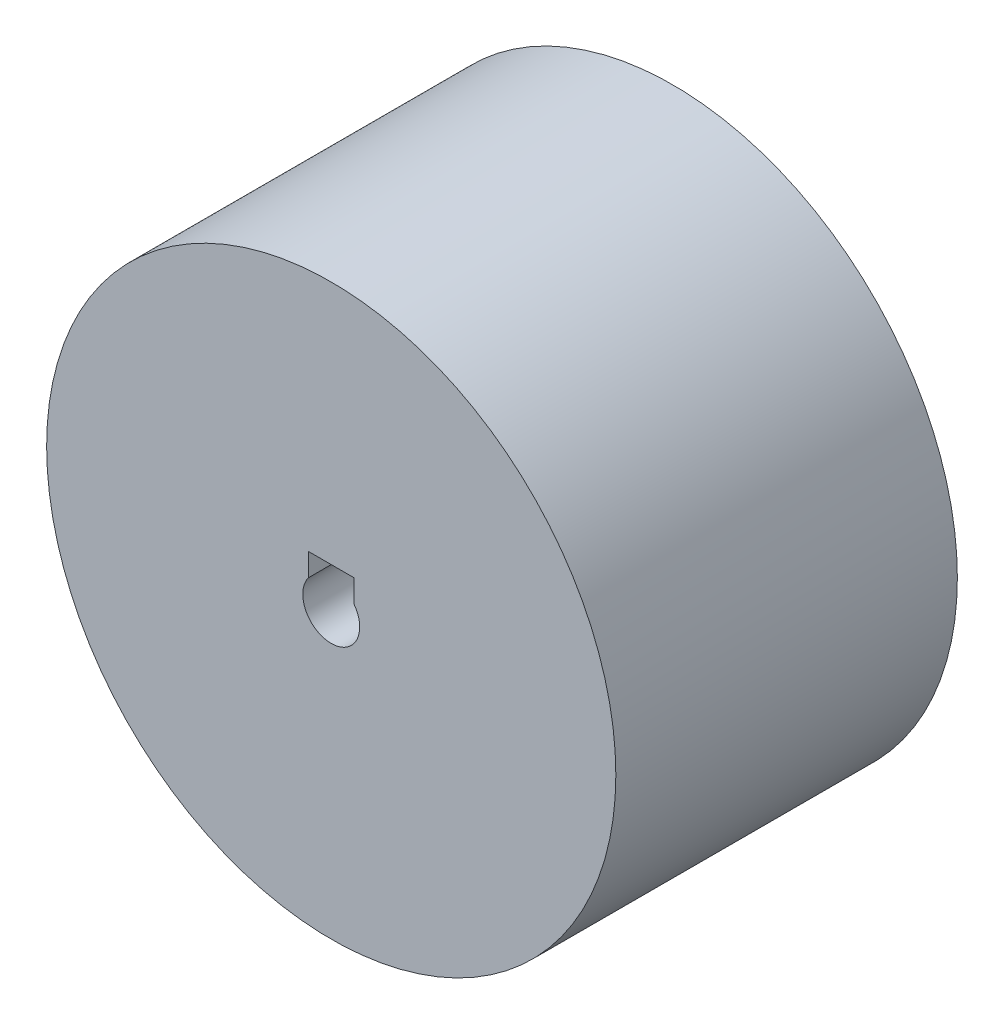
ISO-10303-21;
HEADER;
FILE_DESCRIPTION(('STEP AP214'),'2;1');
FILE_NAME('part.step','',(''),(''),'','','');
FILE_SCHEMA(('AUTOMOTIVE_DESIGN { 1 0 10303 214 1 1 1 1 }'));
ENDSEC;
DATA;
#1=APPLICATION_CONTEXT('core data for automotive mechanical design processes');
#2=APPLICATION_PROTOCOL_DEFINITION('international standard','automotive_design',2000,#1);
#3=PRODUCT_CONTEXT('',#1,'mechanical');
#4=PRODUCT('Part','Part','',(#3));
#5=PRODUCT_RELATED_PRODUCT_CATEGORY('part','',(#4));
#6=PRODUCT_DEFINITION_FORMATION('','',#4);
#7=PRODUCT_DEFINITION_CONTEXT('part definition',#1,'design');
#8=PRODUCT_DEFINITION('design','',#6,#7);
#9=PRODUCT_DEFINITION_SHAPE('','',#8);
#10=(LENGTH_UNIT() NAMED_UNIT(*) SI_UNIT(.MILLI.,.METRE.));
#11=(NAMED_UNIT(*) PLANE_ANGLE_UNIT() SI_UNIT($,.RADIAN.));
#12=(NAMED_UNIT(*) SI_UNIT($,.STERADIAN.) SOLID_ANGLE_UNIT());
#13=UNCERTAINTY_MEASURE_WITH_UNIT(LENGTH_MEASURE(1.E-05),#10,'distance_accuracy_value','');
#14=(GEOMETRIC_REPRESENTATION_CONTEXT(3) GLOBAL_UNCERTAINTY_ASSIGNED_CONTEXT((#13)) GLOBAL_UNIT_ASSIGNED_CONTEXT((#10,
#11,#12)) REPRESENTATION_CONTEXT('',''));
#15=CARTESIAN_POINT('',(0.,0.,0.));
#16=DIRECTION('',(0.,0.,1.));
#17=DIRECTION('',(1.,0.,0.));
#18=AXIS2_PLACEMENT_3D('',#15,#16,#17);
#19=CARTESIAN_POINT('',(0.,0.,30.));
#20=DIRECTION('',(0.,0.,-1.));
#21=DIRECTION('',(-1.,0.,0.));
#22=AXIS2_PLACEMENT_3D('',#19,#20,#21);
#23=CYLINDRICAL_SURFACE('',#22,25.);
#24=CARTESIAN_POINT('',(0.,0.,30.));
#25=DIRECTION('',(0.,0.,1.));
#26=DIRECTION('',(1.,0.,0.));
#27=AXIS2_PLACEMENT_3D('',#24,#25,#26);
#28=CIRCLE('',#27,25.);
#29=CARTESIAN_POINT('',(25.,0.,30.));
#30=VERTEX_POINT('',#29);
#31=EDGE_CURVE('E11',#30,#30,#28,.T.);
#32=ORIENTED_EDGE('',*,*,#31,.F.);
#33=EDGE_LOOP('',(#32));
#34=FACE_BOUND('',#33,.T.);
#35=CARTESIAN_POINT('',(0.,0.,0.));
#36=DIRECTION('',(0.,0.,1.));
#37=DIRECTION('',(1.,0.,0.));
#38=AXIS2_PLACEMENT_3D('',#35,#36,#37);
#39=CIRCLE('',#38,25.);
#40=CARTESIAN_POINT('',(25.,0.,0.));
#41=VERTEX_POINT('',#40);
#42=EDGE_CURVE('E36',#41,#41,#39,.T.);
#43=ORIENTED_EDGE('',*,*,#42,.T.);
#44=EDGE_LOOP('',(#43));
#45=FACE_BOUND('',#44,.T.);
#46=ADVANCED_FACE('F33',(#34,#45),#23,.T.);
#47=CARTESIAN_POINT('',(0.,0.,30.));
#48=DIRECTION('',(0.,0.,1.));
#49=DIRECTION('',(1.,0.,0.));
#50=AXIS2_PLACEMENT_3D('',#47,#48,#49);
#51=PLANE('',#50);
#52=DIRECTION('',(0.,-1.,0.));
#53=VECTOR('',#52,1.);
#54=CARTESIAN_POINT('',(2.,1.5,30.));
#55=LINE('',#54,#53);
#56=CARTESIAN_POINT('',(2.,3.5,30.));
#57=VERTEX_POINT('',#56);
#58=CARTESIAN_POINT('',(2.,1.5,30.));
#59=VERTEX_POINT('',#58);
#60=EDGE_CURVE('E89',#57,#59,#55,.T.);
#61=ORIENTED_EDGE('',*,*,#60,.T.);
#62=CARTESIAN_POINT('',(0.,0.,30.));
#63=DIRECTION('',(0.,0.,-1.));
#64=DIRECTION('',(-1.,0.,0.));
#65=AXIS2_PLACEMENT_3D('',#62,#63,#64);
#66=CIRCLE('',#65,2.5);
#67=CARTESIAN_POINT('',(-2.,1.5,30.));
#68=VERTEX_POINT('',#67);
#69=EDGE_CURVE('E95',#59,#68,#66,.T.);
#70=ORIENTED_EDGE('',*,*,#69,.T.);
#71=DIRECTION('',(0.,1.,0.));
#72=VECTOR('',#71,1.);
#73=CARTESIAN_POINT('',(-2.,3.5,30.));
#74=LINE('',#73,#72);
#75=CARTESIAN_POINT('',(-2.,3.5,30.));
#76=VERTEX_POINT('',#75);
#77=EDGE_CURVE('E47',#68,#76,#74,.T.);
#78=ORIENTED_EDGE('',*,*,#77,.T.);
#79=DIRECTION('',(1.,0.,0.));
#80=VECTOR('',#79,1.);
#81=CARTESIAN_POINT('',(2.,3.5,30.));
#82=LINE('',#81,#80);
#83=EDGE_CURVE('E86',#76,#57,#82,.T.);
#84=ORIENTED_EDGE('',*,*,#83,.T.);
#85=EDGE_LOOP('',(#61,#70,#78,#84));
#86=FACE_BOUND('',#85,.T.);
#87=ORIENTED_EDGE('',*,*,#31,.T.);
#88=EDGE_LOOP('',(#87));
#89=FACE_BOUND('',#88,.T.);
#90=ADVANCED_FACE('F92',(#86,#89),#51,.T.);
#91=CARTESIAN_POINT('',(0.,0.,0.));
#92=DIRECTION('',(0.,0.,1.));
#93=DIRECTION('',(1.,0.,0.));
#94=AXIS2_PLACEMENT_3D('',#91,#92,#93);
#95=PLANE('',#94);
#96=CARTESIAN_POINT('',(0.,0.,0.));
#97=DIRECTION('',(0.,0.,-1.));
#98=DIRECTION('',(-1.,0.,0.));
#99=AXIS2_PLACEMENT_3D('',#96,#97,#98);
#100=CIRCLE('',#99,2.5);
#101=CARTESIAN_POINT('',(2.,1.5,0.));
#102=VERTEX_POINT('',#101);
#103=CARTESIAN_POINT('',(-2.,1.5,0.));
#104=VERTEX_POINT('',#103);
#105=EDGE_CURVE('E104',#102,#104,#100,.T.);
#106=ORIENTED_EDGE('',*,*,#105,.F.);
#107=DIRECTION('',(0.,-1.,0.));
#108=VECTOR('',#107,1.);
#109=CARTESIAN_POINT('',(2.,1.5,0.));
#110=LINE('',#109,#108);
#111=CARTESIAN_POINT('',(2.,3.5,0.));
#112=VERTEX_POINT('',#111);
#113=EDGE_CURVE('E72',#112,#102,#110,.T.);
#114=ORIENTED_EDGE('',*,*,#113,.F.);
#115=DIRECTION('',(1.,0.,0.));
#116=VECTOR('',#115,1.);
#117=CARTESIAN_POINT('',(2.,3.5,0.));
#118=LINE('',#117,#116);
#119=CARTESIAN_POINT('',(-2.,3.5,0.));
#120=VERTEX_POINT('',#119);
#121=EDGE_CURVE('E97',#120,#112,#118,.T.);
#122=ORIENTED_EDGE('',*,*,#121,.F.);
#123=DIRECTION('',(0.,1.,0.));
#124=VECTOR('',#123,1.);
#125=CARTESIAN_POINT('',(-2.,3.5,0.));
#126=LINE('',#125,#124);
#127=EDGE_CURVE('E78',#104,#120,#126,.T.);
#128=ORIENTED_EDGE('',*,*,#127,.F.);
#129=EDGE_LOOP('',(#106,#114,#122,#128));
#130=FACE_BOUND('',#129,.T.);
#131=ORIENTED_EDGE('',*,*,#42,.F.);
#132=EDGE_LOOP('',(#131));
#133=FACE_BOUND('',#132,.T.);
#134=ADVANCED_FACE('F113',(#130,#133),#95,.F.);
#135=CARTESIAN_POINT('',(0.,0.,30.));
#136=DIRECTION('',(0.,0.,-1.));
#137=DIRECTION('',(-1.,0.,0.));
#138=AXIS2_PLACEMENT_3D('',#135,#136,#137);
#139=CYLINDRICAL_SURFACE('',#138,2.5);
#140=ORIENTED_EDGE('',*,*,#69,.F.);
#141=DIRECTION('',(0.,0.,-1.));
#142=VECTOR('',#141,1.);
#143=CARTESIAN_POINT('',(2.,1.5,30.));
#144=LINE('',#143,#142);
#145=EDGE_CURVE('E56',#59,#102,#144,.T.);
#146=ORIENTED_EDGE('',*,*,#145,.T.);
#147=ORIENTED_EDGE('',*,*,#105,.T.);
#148=DIRECTION('',(0.,0.,-1.));
#149=VECTOR('',#148,1.);
#150=CARTESIAN_POINT('',(-2.,1.5,30.));
#151=LINE('',#150,#149);
#152=EDGE_CURVE('E83',#68,#104,#151,.T.);
#153=ORIENTED_EDGE('',*,*,#152,.F.);
#154=EDGE_LOOP('',(#140,#146,#147,#153));
#155=FACE_BOUND('',#154,.T.);
#156=ADVANCED_FACE('F111',(#155),#139,.F.);
#157=CARTESIAN_POINT('',(2.,1.5,30.));
#158=DIRECTION('',(1.,0.,0.));
#159=DIRECTION('',(0.,0.,-1.));
#160=AXIS2_PLACEMENT_3D('',#157,#158,#159);
#161=PLANE('',#160);
#162=ORIENTED_EDGE('',*,*,#113,.T.);
#163=ORIENTED_EDGE('',*,*,#145,.F.);
#164=ORIENTED_EDGE('',*,*,#60,.F.);
#165=DIRECTION('',(0.,0.,-1.));
#166=VECTOR('',#165,1.);
#167=CARTESIAN_POINT('',(2.,3.5,30.));
#168=LINE('',#167,#166);
#169=EDGE_CURVE('E82',#57,#112,#168,.T.);
#170=ORIENTED_EDGE('',*,*,#169,.T.);
#171=EDGE_LOOP('',(#162,#163,#164,#170));
#172=FACE_BOUND('',#171,.T.);
#173=ADVANCED_FACE('F131',(#172),#161,.F.);
#174=CARTESIAN_POINT('',(2.,3.5,30.));
#175=DIRECTION('',(0.,1.,0.));
#176=DIRECTION('',(0.,0.,1.));
#177=AXIS2_PLACEMENT_3D('',#174,#175,#176);
#178=PLANE('',#177);
#179=ORIENTED_EDGE('',*,*,#121,.T.);
#180=ORIENTED_EDGE('',*,*,#169,.F.);
#181=ORIENTED_EDGE('',*,*,#83,.F.);
#182=DIRECTION('',(0.,0.,-1.));
#183=VECTOR('',#182,1.);
#184=CARTESIAN_POINT('',(-2.,3.5,30.));
#185=LINE('',#184,#183);
#186=EDGE_CURVE('E74',#76,#120,#185,.T.);
#187=ORIENTED_EDGE('',*,*,#186,.T.);
#188=EDGE_LOOP('',(#179,#180,#181,#187));
#189=FACE_BOUND('',#188,.T.);
#190=ADVANCED_FACE('F87',(#189),#178,.F.);
#191=CARTESIAN_POINT('',(-2.,3.5,30.));
#192=DIRECTION('',(-1.,0.,0.));
#193=DIRECTION('',(0.,0.,1.));
#194=AXIS2_PLACEMENT_3D('',#191,#192,#193);
#195=PLANE('',#194);
#196=ORIENTED_EDGE('',*,*,#127,.T.);
#197=ORIENTED_EDGE('',*,*,#186,.F.);
#198=ORIENTED_EDGE('',*,*,#77,.F.);
#199=ORIENTED_EDGE('',*,*,#152,.T.);
#200=EDGE_LOOP('',(#196,#197,#198,#199));
#201=FACE_BOUND('',#200,.T.);
#202=ADVANCED_FACE('F76',(#201),#195,.F.);
#203=CLOSED_SHELL('',(#46,#90,#134,#156,#173,#190,#202));
#204=MANIFOLD_SOLID_BREP('B2',#203);
#205=ADVANCED_BREP_SHAPE_REPRESENTATION('',(#18,#204),#14);
#206=SHAPE_DEFINITION_REPRESENTATION(#9,#205);
ENDSEC;
END-ISO-10303-21;
